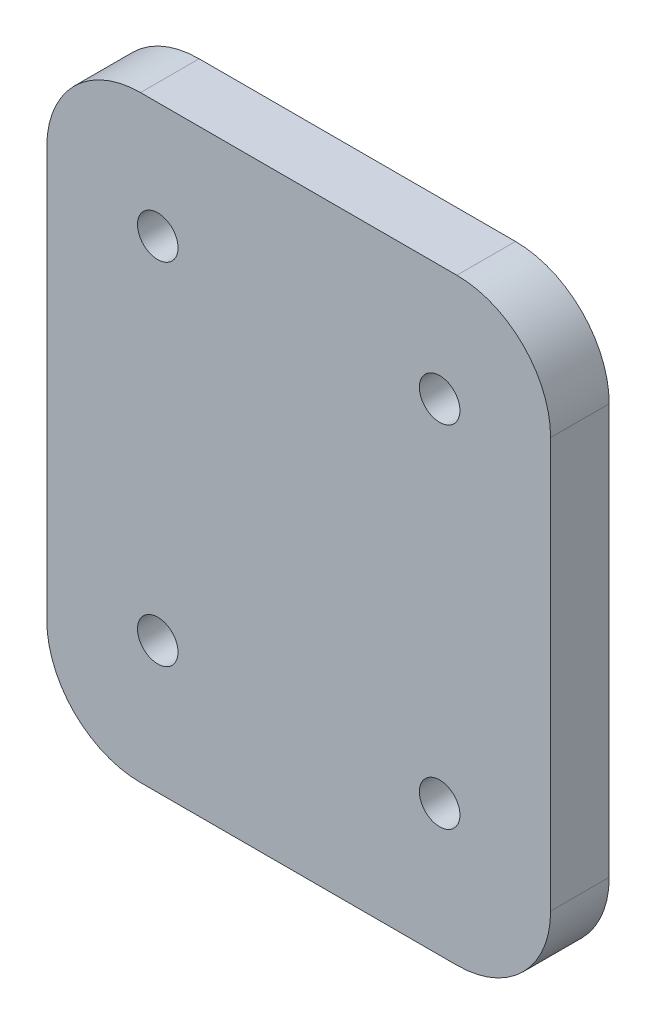
ISO-10303-21;
HEADER;
FILE_DESCRIPTION(('STEP AP214'),'2;1');
FILE_NAME('part.step','',(''),(''),'','','');
FILE_SCHEMA(('AUTOMOTIVE_DESIGN { 1 0 10303 214 1 1 1 1 }'));
ENDSEC;
DATA;
#1=APPLICATION_CONTEXT('core data for automotive mechanical design processes');
#2=APPLICATION_PROTOCOL_DEFINITION('international standard','automotive_design',2000,#1);
#3=PRODUCT_CONTEXT('',#1,'mechanical');
#4=PRODUCT('Part','Part','',(#3));
#5=PRODUCT_RELATED_PRODUCT_CATEGORY('part','',(#4));
#6=PRODUCT_DEFINITION_FORMATION('','',#4);
#7=PRODUCT_DEFINITION_CONTEXT('part definition',#1,'design');
#8=PRODUCT_DEFINITION('design','',#6,#7);
#9=PRODUCT_DEFINITION_SHAPE('','',#8);
#10=(LENGTH_UNIT() NAMED_UNIT(*) SI_UNIT(.MILLI.,.METRE.));
#11=(NAMED_UNIT(*) PLANE_ANGLE_UNIT() SI_UNIT($,.RADIAN.));
#12=(NAMED_UNIT(*) SI_UNIT($,.STERADIAN.) SOLID_ANGLE_UNIT());
#13=UNCERTAINTY_MEASURE_WITH_UNIT(LENGTH_MEASURE(1.E-05),#10,'distance_accuracy_value','');
#14=(GEOMETRIC_REPRESENTATION_CONTEXT(3) GLOBAL_UNCERTAINTY_ASSIGNED_CONTEXT((#13)) GLOBAL_UNIT_ASSIGNED_CONTEXT((#10,
#11,#12)) REPRESENTATION_CONTEXT('',''));
#15=CARTESIAN_POINT('',(0.,0.,0.));
#16=DIRECTION('',(0.,0.,1.));
#17=DIRECTION('',(1.,0.,0.));
#18=AXIS2_PLACEMENT_3D('',#15,#16,#17);
#19=CARTESIAN_POINT('',(54.2600000000001,16.7731395348769,5.));
#20=DIRECTION('',(0.,0.,1.));
#21=DIRECTION('',(1.,0.,0.));
#22=AXIS2_PLACEMENT_3D('',#19,#20,#21);
#23=PLANE('',#22);
#24=CARTESIAN_POINT('',(55.7300000000001,-14.9950000000068,5.));
#25=DIRECTION('',(0.,0.,1.));
#26=DIRECTION('',(1.,0.,0.));
#27=AXIS2_PLACEMENT_3D('',#24,#25,#26);
#28=CIRCLE('',#27,1.73);
#29=CARTESIAN_POINT('',(57.4600000000001,-14.9950000000068,5.));
#30=VERTEX_POINT('',#29);
#31=EDGE_CURVE('E224',#30,#30,#28,.T.);
#32=ORIENTED_EDGE('',*,*,#31,.F.);
#33=EDGE_LOOP('',(#32));
#34=FACE_BOUND('',#33,.T.);
#35=CARTESIAN_POINT('',(79.79,14.8949999999932,5.));
#36=DIRECTION('',(0.,0.,1.));
#37=DIRECTION('',(1.,0.,0.));
#38=AXIS2_PLACEMENT_3D('',#35,#36,#37);
#39=CIRCLE('',#38,1.72999999999999);
#40=CARTESIAN_POINT('',(81.5200000000001,14.8949999999932,5.));
#41=VERTEX_POINT('',#40);
#42=EDGE_CURVE('E149',#41,#41,#39,.T.);
#43=ORIENTED_EDGE('',*,*,#42,.F.);
#44=EDGE_LOOP('',(#43));
#45=FACE_BOUND('',#44,.T.);
#46=CARTESIAN_POINT('',(54.2600000000001,16.7731395348769,5.));
#47=DIRECTION('',(0.,0.,1.));
#48=DIRECTION('',(1.,0.,0.));
#49=AXIS2_PLACEMENT_3D('',#46,#47,#48);
#50=CIRCLE('',#49,8.);
#51=CARTESIAN_POINT('',(54.2600000000001,24.7731395348769,5.));
#52=VERTEX_POINT('',#51);
#53=CARTESIAN_POINT('',(46.2600000000001,16.7731395348769,5.));
#54=VERTEX_POINT('',#53);
#55=EDGE_CURVE('E167',#52,#54,#50,.T.);
#56=ORIENTED_EDGE('',*,*,#55,.T.);
#57=DIRECTION('',(0.,-1.,0.));
#58=VECTOR('',#57,1.);
#59=CARTESIAN_POINT('',(46.2600000000001,-18.2268604651231,5.));
#60=LINE('',#59,#58);
#61=CARTESIAN_POINT('',(46.2600000000001,-18.2268604651231,5.));
#62=VERTEX_POINT('',#61);
#63=EDGE_CURVE('E103',#54,#62,#60,.T.);
#64=ORIENTED_EDGE('',*,*,#63,.T.);
#65=CARTESIAN_POINT('',(54.2600000000001,-18.2268604651231,5.));
#66=DIRECTION('',(0.,0.,1.));
#67=DIRECTION('',(-1.,0.,0.));
#68=AXIS2_PLACEMENT_3D('',#65,#66,#67);
#69=CIRCLE('',#68,8.);
#70=CARTESIAN_POINT('',(54.2600000000001,-26.2268604651231,5.));
#71=VERTEX_POINT('',#70);
#72=EDGE_CURVE('E188',#62,#71,#69,.T.);
#73=ORIENTED_EDGE('',*,*,#72,.T.);
#74=DIRECTION('',(1.,0.,0.));
#75=VECTOR('',#74,1.);
#76=CARTESIAN_POINT('',(81.26,-26.226860465123,5.));
#77=LINE('',#76,#75);
#78=CARTESIAN_POINT('',(81.26,-26.2268604651231,5.));
#79=VERTEX_POINT('',#78);
#80=EDGE_CURVE('E202',#71,#79,#77,.T.);
#81=ORIENTED_EDGE('',*,*,#80,.T.);
#82=CARTESIAN_POINT('',(81.26,-18.226860465123,5.));
#83=DIRECTION('',(0.,0.,1.));
#84=DIRECTION('',(1.,0.,0.));
#85=AXIS2_PLACEMENT_3D('',#82,#83,#84);
#86=CIRCLE('',#85,8.00000000000001);
#87=CARTESIAN_POINT('',(89.2600000000001,-18.226860465123,5.));
#88=VERTEX_POINT('',#87);
#89=EDGE_CURVE('E122',#79,#88,#86,.T.);
#90=ORIENTED_EDGE('',*,*,#89,.T.);
#91=DIRECTION('',(0.,1.,0.));
#92=VECTOR('',#91,1.);
#93=CARTESIAN_POINT('',(89.2600000000001,-18.226860465123,5.));
#94=LINE('',#93,#92);
#95=CARTESIAN_POINT('',(89.2600000000001,16.7731395348769,5.));
#96=VERTEX_POINT('',#95);
#97=EDGE_CURVE('E116',#88,#96,#94,.T.);
#98=ORIENTED_EDGE('',*,*,#97,.T.);
#99=CARTESIAN_POINT('',(81.26,16.7731395348769,5.));
#100=DIRECTION('',(0.,0.,1.));
#101=DIRECTION('',(1.,0.,0.));
#102=AXIS2_PLACEMENT_3D('',#99,#100,#101);
#103=CIRCLE('',#102,8.);
#104=CARTESIAN_POINT('',(81.26,24.7731395348769,5.));
#105=VERTEX_POINT('',#104);
#106=EDGE_CURVE('E120',#96,#105,#103,.T.);
#107=ORIENTED_EDGE('',*,*,#106,.T.);
#108=DIRECTION('',(-1.,0.,0.));
#109=VECTOR('',#108,1.);
#110=CARTESIAN_POINT('',(81.26,24.7731395348769,5.));
#111=LINE('',#110,#109);
#112=EDGE_CURVE('E60',#105,#52,#111,.T.);
#113=ORIENTED_EDGE('',*,*,#112,.T.);
#114=EDGE_LOOP('',(#56,#64,#73,#81,#90,#98,#107,#113));
#115=FACE_BOUND('',#114,.T.);
#116=CARTESIAN_POINT('',(55.7300000000001,14.8949999999932,5.));
#117=DIRECTION('',(0.,0.,1.));
#118=DIRECTION('',(1.,0.,0.));
#119=AXIS2_PLACEMENT_3D('',#116,#117,#118);
#120=CIRCLE('',#119,1.73);
#121=CARTESIAN_POINT('',(57.4600000000001,14.8949999999932,5.));
#122=VERTEX_POINT('',#121);
#123=EDGE_CURVE('E216',#122,#122,#120,.T.);
#124=ORIENTED_EDGE('',*,*,#123,.F.);
#125=EDGE_LOOP('',(#124));
#126=FACE_BOUND('',#125,.T.);
#127=CARTESIAN_POINT('',(79.7900000000001,-14.9950000000068,5.));
#128=DIRECTION('',(0.,0.,1.));
#129=DIRECTION('',(1.,0.,0.));
#130=AXIS2_PLACEMENT_3D('',#127,#128,#129);
#131=CIRCLE('',#130,1.72999999999999);
#132=CARTESIAN_POINT('',(81.5200000000001,-14.9950000000068,5.));
#133=VERTEX_POINT('',#132);
#134=EDGE_CURVE('E232',#133,#133,#131,.T.);
#135=ORIENTED_EDGE('',*,*,#134,.F.);
#136=EDGE_LOOP('',(#135));
#137=FACE_BOUND('',#136,.T.);
#138=ADVANCED_FACE('F42',(#34,#45,#115,#126,#137),#23,.T.);
#139=CARTESIAN_POINT('',(54.2600000000001,16.7731395348769,0.));
#140=DIRECTION('',(0.,0.,1.));
#141=DIRECTION('',(1.,0.,0.));
#142=AXIS2_PLACEMENT_3D('',#139,#140,#141);
#143=PLANE('',#142);
#144=CARTESIAN_POINT('',(54.2600000000001,16.7731395348769,0.));
#145=DIRECTION('',(0.,0.,1.));
#146=DIRECTION('',(1.,0.,0.));
#147=AXIS2_PLACEMENT_3D('',#144,#145,#146);
#148=CIRCLE('',#147,8.);
#149=CARTESIAN_POINT('',(54.2600000000001,24.7731395348769,0.));
#150=VERTEX_POINT('',#149);
#151=CARTESIAN_POINT('',(46.2600000000001,16.7731395348769,0.));
#152=VERTEX_POINT('',#151);
#153=EDGE_CURVE('E144',#150,#152,#148,.T.);
#154=ORIENTED_EDGE('',*,*,#153,.F.);
#155=DIRECTION('',(-1.,0.,0.));
#156=VECTOR('',#155,1.);
#157=CARTESIAN_POINT('',(81.26,24.7731395348769,0.));
#158=LINE('',#157,#156);
#159=CARTESIAN_POINT('',(81.26,24.7731395348769,0.));
#160=VERTEX_POINT('',#159);
#161=EDGE_CURVE('E95',#160,#150,#158,.T.);
#162=ORIENTED_EDGE('',*,*,#161,.F.);
#163=CARTESIAN_POINT('',(81.26,16.7731395348769,0.));
#164=DIRECTION('',(0.,0.,1.));
#165=DIRECTION('',(1.,0.,0.));
#166=AXIS2_PLACEMENT_3D('',#163,#164,#165);
#167=CIRCLE('',#166,8.);
#168=CARTESIAN_POINT('',(89.2600000000001,16.7731395348769,0.));
#169=VERTEX_POINT('',#168);
#170=EDGE_CURVE('E89',#169,#160,#167,.T.);
#171=ORIENTED_EDGE('',*,*,#170,.F.);
#172=DIRECTION('',(0.,1.,0.));
#173=VECTOR('',#172,1.);
#174=CARTESIAN_POINT('',(89.2600000000001,-18.226860465123,0.));
#175=LINE('',#174,#173);
#176=CARTESIAN_POINT('',(89.2600000000001,-18.226860465123,0.));
#177=VERTEX_POINT('',#176);
#178=EDGE_CURVE('E131',#177,#169,#175,.T.);
#179=ORIENTED_EDGE('',*,*,#178,.F.);
#180=CARTESIAN_POINT('',(81.26,-18.226860465123,0.));
#181=DIRECTION('',(0.,0.,1.));
#182=DIRECTION('',(1.,0.,0.));
#183=AXIS2_PLACEMENT_3D('',#180,#181,#182);
#184=CIRCLE('',#183,8.00000000000001);
#185=CARTESIAN_POINT('',(81.26,-26.2268604651231,0.));
#186=VERTEX_POINT('',#185);
#187=EDGE_CURVE('E158',#186,#177,#184,.T.);
#188=ORIENTED_EDGE('',*,*,#187,.F.);
#189=DIRECTION('',(1.,0.,0.));
#190=VECTOR('',#189,1.);
#191=CARTESIAN_POINT('',(81.26,-26.226860465123,0.));
#192=LINE('',#191,#190);
#193=CARTESIAN_POINT('',(54.2600000000001,-26.2268604651231,0.));
#194=VERTEX_POINT('',#193);
#195=EDGE_CURVE('E155',#194,#186,#192,.T.);
#196=ORIENTED_EDGE('',*,*,#195,.F.);
#197=CARTESIAN_POINT('',(54.2600000000001,-18.2268604651231,0.));
#198=DIRECTION('',(0.,0.,1.));
#199=DIRECTION('',(-1.,0.,0.));
#200=AXIS2_PLACEMENT_3D('',#197,#198,#199);
#201=CIRCLE('',#200,8.);
#202=CARTESIAN_POINT('',(46.2600000000001,-18.2268604651231,0.));
#203=VERTEX_POINT('',#202);
#204=EDGE_CURVE('E152',#203,#194,#201,.T.);
#205=ORIENTED_EDGE('',*,*,#204,.F.);
#206=DIRECTION('',(0.,-1.,0.));
#207=VECTOR('',#206,1.);
#208=CARTESIAN_POINT('',(46.2600000000001,-18.2268604651231,0.));
#209=LINE('',#208,#207);
#210=EDGE_CURVE('E148',#152,#203,#209,.T.);
#211=ORIENTED_EDGE('',*,*,#210,.F.);
#212=EDGE_LOOP('',(#154,#162,#171,#179,#188,#196,#205,#211));
#213=FACE_BOUND('',#212,.T.);
#214=CARTESIAN_POINT('',(79.79,14.8949999999932,0.));
#215=DIRECTION('',(0.,0.,1.));
#216=DIRECTION('',(1.,0.,0.));
#217=AXIS2_PLACEMENT_3D('',#214,#215,#216);
#218=CIRCLE('',#217,1.72999999999999);
#219=CARTESIAN_POINT('',(81.5200000000001,14.8949999999932,0.));
#220=VERTEX_POINT('',#219);
#221=EDGE_CURVE('E212',#220,#220,#218,.T.);
#222=ORIENTED_EDGE('',*,*,#221,.T.);
#223=EDGE_LOOP('',(#222));
#224=FACE_BOUND('',#223,.T.);
#225=CARTESIAN_POINT('',(55.7300000000001,14.8949999999932,0.));
#226=DIRECTION('',(0.,0.,1.));
#227=DIRECTION('',(1.,0.,0.));
#228=AXIS2_PLACEMENT_3D('',#225,#226,#227);
#229=CIRCLE('',#228,1.73);
#230=CARTESIAN_POINT('',(57.4600000000001,14.8949999999932,0.));
#231=VERTEX_POINT('',#230);
#232=EDGE_CURVE('E220',#231,#231,#229,.T.);
#233=ORIENTED_EDGE('',*,*,#232,.T.);
#234=EDGE_LOOP('',(#233));
#235=FACE_BOUND('',#234,.T.);
#236=CARTESIAN_POINT('',(55.7300000000001,-14.9950000000068,0.));
#237=DIRECTION('',(0.,0.,1.));
#238=DIRECTION('',(1.,0.,0.));
#239=AXIS2_PLACEMENT_3D('',#236,#237,#238);
#240=CIRCLE('',#239,1.73);
#241=CARTESIAN_POINT('',(57.4600000000001,-14.9950000000068,0.));
#242=VERTEX_POINT('',#241);
#243=EDGE_CURVE('E228',#242,#242,#240,.T.);
#244=ORIENTED_EDGE('',*,*,#243,.T.);
#245=EDGE_LOOP('',(#244));
#246=FACE_BOUND('',#245,.T.);
#247=CARTESIAN_POINT('',(79.7900000000001,-14.9950000000068,0.));
#248=DIRECTION('',(0.,0.,1.));
#249=DIRECTION('',(1.,0.,0.));
#250=AXIS2_PLACEMENT_3D('',#247,#248,#249);
#251=CIRCLE('',#250,1.72999999999999);
#252=CARTESIAN_POINT('',(81.5200000000001,-14.9950000000068,0.));
#253=VERTEX_POINT('',#252);
#254=EDGE_CURVE('E236',#253,#253,#251,.T.);
#255=ORIENTED_EDGE('',*,*,#254,.T.);
#256=EDGE_LOOP('',(#255));
#257=FACE_BOUND('',#256,.T.);
#258=ADVANCED_FACE('F192',(#213,#224,#235,#246,#257),#143,.F.);
#259=CARTESIAN_POINT('',(54.2600000000001,16.7731395348769,5.));
#260=DIRECTION('',(0.,0.,-1.));
#261=DIRECTION('',(-1.,0.,0.));
#262=AXIS2_PLACEMENT_3D('',#259,#260,#261);
#263=CYLINDRICAL_SURFACE('',#262,8.);
#264=ORIENTED_EDGE('',*,*,#153,.T.);
#265=DIRECTION('',(0.,0.,-1.));
#266=VECTOR('',#265,1.);
#267=CARTESIAN_POINT('',(46.2600000000001,16.7731395348769,5.));
#268=LINE('',#267,#266);
#269=EDGE_CURVE('E11',#54,#152,#268,.T.);
#270=ORIENTED_EDGE('',*,*,#269,.F.);
#271=ORIENTED_EDGE('',*,*,#55,.F.);
#272=DIRECTION('',(0.,0.,-1.));
#273=VECTOR('',#272,1.);
#274=CARTESIAN_POINT('',(54.2600000000001,24.7731395348769,5.));
#275=LINE('',#274,#273);
#276=EDGE_CURVE('E140',#52,#150,#275,.T.);
#277=ORIENTED_EDGE('',*,*,#276,.T.);
#278=EDGE_LOOP('',(#264,#270,#271,#277));
#279=FACE_BOUND('',#278,.T.);
#280=ADVANCED_FACE('F44',(#279),#263,.T.);
#281=CARTESIAN_POINT('',(46.2600000000001,-18.2268604651231,5.));
#282=DIRECTION('',(1.,0.,0.));
#283=DIRECTION('',(0.,1.,0.));
#284=AXIS2_PLACEMENT_3D('',#281,#282,#283);
#285=PLANE('',#284);
#286=ORIENTED_EDGE('',*,*,#210,.T.);
#287=DIRECTION('',(0.,0.,-1.));
#288=VECTOR('',#287,1.);
#289=CARTESIAN_POINT('',(46.2600000000001,-18.2268604651231,5.));
#290=LINE('',#289,#288);
#291=EDGE_CURVE('E52',#62,#203,#290,.T.);
#292=ORIENTED_EDGE('',*,*,#291,.F.);
#293=ORIENTED_EDGE('',*,*,#63,.F.);
#294=ORIENTED_EDGE('',*,*,#269,.T.);
#295=EDGE_LOOP('',(#286,#292,#293,#294));
#296=FACE_BOUND('',#295,.T.);
#297=ADVANCED_FACE('F272',(#296),#285,.F.);
#298=CARTESIAN_POINT('',(54.2600000000001,-18.2268604651231,5.));
#299=DIRECTION('',(0.,0.,-1.));
#300=DIRECTION('',(-1.,0.,0.));
#301=AXIS2_PLACEMENT_3D('',#298,#299,#300);
#302=CYLINDRICAL_SURFACE('',#301,8.);
#303=ORIENTED_EDGE('',*,*,#204,.T.);
#304=DIRECTION('',(0.,0.,-1.));
#305=VECTOR('',#304,1.);
#306=CARTESIAN_POINT('',(54.2600000000001,-26.2268604651231,5.));
#307=LINE('',#306,#305);
#308=EDGE_CURVE('E178',#71,#194,#307,.T.);
#309=ORIENTED_EDGE('',*,*,#308,.F.);
#310=ORIENTED_EDGE('',*,*,#72,.F.);
#311=ORIENTED_EDGE('',*,*,#291,.T.);
#312=EDGE_LOOP('',(#303,#309,#310,#311));
#313=FACE_BOUND('',#312,.T.);
#314=ADVANCED_FACE('F186',(#313),#302,.T.);
#315=CARTESIAN_POINT('',(81.26,-26.226860465123,5.));
#316=DIRECTION('',(0.,1.,0.));
#317=DIRECTION('',(-1.,0.,0.));
#318=AXIS2_PLACEMENT_3D('',#315,#316,#317);
#319=PLANE('',#318);
#320=ORIENTED_EDGE('',*,*,#195,.T.);
#321=DIRECTION('',(0.,0.,-1.));
#322=VECTOR('',#321,1.);
#323=CARTESIAN_POINT('',(81.26,-26.2268604651231,5.));
#324=LINE('',#323,#322);
#325=EDGE_CURVE('E174',#79,#186,#324,.T.);
#326=ORIENTED_EDGE('',*,*,#325,.F.);
#327=ORIENTED_EDGE('',*,*,#80,.F.);
#328=ORIENTED_EDGE('',*,*,#308,.T.);
#329=EDGE_LOOP('',(#320,#326,#327,#328));
#330=FACE_BOUND('',#329,.T.);
#331=ADVANCED_FACE('F197',(#330),#319,.F.);
#332=CARTESIAN_POINT('',(81.26,-18.226860465123,5.));
#333=DIRECTION('',(0.,0.,-1.));
#334=DIRECTION('',(-1.,0.,0.));
#335=AXIS2_PLACEMENT_3D('',#332,#333,#334);
#336=CYLINDRICAL_SURFACE('',#335,8.00000000000001);
#337=ORIENTED_EDGE('',*,*,#187,.T.);
#338=DIRECTION('',(0.,0.,-1.));
#339=VECTOR('',#338,1.);
#340=CARTESIAN_POINT('',(89.2600000000001,-18.226860465123,5.));
#341=LINE('',#340,#339);
#342=EDGE_CURVE('E133',#88,#177,#341,.T.);
#343=ORIENTED_EDGE('',*,*,#342,.F.);
#344=ORIENTED_EDGE('',*,*,#89,.F.);
#345=ORIENTED_EDGE('',*,*,#325,.T.);
#346=EDGE_LOOP('',(#337,#343,#344,#345));
#347=FACE_BOUND('',#346,.T.);
#348=ADVANCED_FACE('F200',(#347),#336,.T.);
#349=CARTESIAN_POINT('',(89.2600000000001,-18.226860465123,5.));
#350=DIRECTION('',(-1.,0.,0.));
#351=DIRECTION('',(0.,-1.,0.));
#352=AXIS2_PLACEMENT_3D('',#349,#350,#351);
#353=PLANE('',#352);
#354=ORIENTED_EDGE('',*,*,#178,.T.);
#355=DIRECTION('',(0.,0.,-1.));
#356=VECTOR('',#355,1.);
#357=CARTESIAN_POINT('',(89.2600000000001,16.7731395348769,5.));
#358=LINE('',#357,#356);
#359=EDGE_CURVE('E128',#96,#169,#358,.T.);
#360=ORIENTED_EDGE('',*,*,#359,.F.);
#361=ORIENTED_EDGE('',*,*,#97,.F.);
#362=ORIENTED_EDGE('',*,*,#342,.T.);
#363=EDGE_LOOP('',(#354,#360,#361,#362));
#364=FACE_BOUND('',#363,.T.);
#365=ADVANCED_FACE('F129',(#364),#353,.F.);
#366=CARTESIAN_POINT('',(81.26,16.7731395348769,5.));
#367=DIRECTION('',(0.,0.,-1.));
#368=DIRECTION('',(-1.,0.,0.));
#369=AXIS2_PLACEMENT_3D('',#366,#367,#368);
#370=CYLINDRICAL_SURFACE('',#369,8.);
#371=ORIENTED_EDGE('',*,*,#170,.T.);
#372=DIRECTION('',(0.,0.,-1.));
#373=VECTOR('',#372,1.);
#374=CARTESIAN_POINT('',(81.26,24.7731395348769,5.));
#375=LINE('',#374,#373);
#376=EDGE_CURVE('E134',#105,#160,#375,.T.);
#377=ORIENTED_EDGE('',*,*,#376,.F.);
#378=ORIENTED_EDGE('',*,*,#106,.F.);
#379=ORIENTED_EDGE('',*,*,#359,.T.);
#380=EDGE_LOOP('',(#371,#377,#378,#379));
#381=FACE_BOUND('',#380,.T.);
#382=ADVANCED_FACE('F136',(#381),#370,.T.);
#383=CARTESIAN_POINT('',(81.26,24.7731395348769,5.));
#384=DIRECTION('',(0.,-1.,0.));
#385=DIRECTION('',(1.,0.,0.));
#386=AXIS2_PLACEMENT_3D('',#383,#384,#385);
#387=PLANE('',#386);
#388=ORIENTED_EDGE('',*,*,#161,.T.);
#389=ORIENTED_EDGE('',*,*,#276,.F.);
#390=ORIENTED_EDGE('',*,*,#112,.F.);
#391=ORIENTED_EDGE('',*,*,#376,.T.);
#392=EDGE_LOOP('',(#388,#389,#390,#391));
#393=FACE_BOUND('',#392,.T.);
#394=ADVANCED_FACE('F260',(#393),#387,.F.);
#395=CARTESIAN_POINT('',(79.79,14.8949999999932,5.));
#396=DIRECTION('',(0.,0.,-1.));
#397=DIRECTION('',(-1.,0.,0.));
#398=AXIS2_PLACEMENT_3D('',#395,#396,#397);
#399=CYLINDRICAL_SURFACE('',#398,1.72999999999999);
#400=ORIENTED_EDGE('',*,*,#42,.T.);
#401=EDGE_LOOP('',(#400));
#402=FACE_BOUND('',#401,.T.);
#403=ORIENTED_EDGE('',*,*,#221,.F.);
#404=EDGE_LOOP('',(#403));
#405=FACE_BOUND('',#404,.T.);
#406=ADVANCED_FACE('F257',(#402,#405),#399,.F.);
#407=CARTESIAN_POINT('',(55.7300000000001,14.8949999999932,5.));
#408=DIRECTION('',(0.,0.,-1.));
#409=DIRECTION('',(-1.,0.,0.));
#410=AXIS2_PLACEMENT_3D('',#407,#408,#409);
#411=CYLINDRICAL_SURFACE('',#410,1.73);
#412=ORIENTED_EDGE('',*,*,#123,.T.);
#413=EDGE_LOOP('',(#412));
#414=FACE_BOUND('',#413,.T.);
#415=ORIENTED_EDGE('',*,*,#232,.F.);
#416=EDGE_LOOP('',(#415));
#417=FACE_BOUND('',#416,.T.);
#418=ADVANCED_FACE('F348',(#414,#417),#411,.F.);
#419=CARTESIAN_POINT('',(55.7300000000001,-14.9950000000068,5.));
#420=DIRECTION('',(0.,0.,-1.));
#421=DIRECTION('',(-1.,0.,0.));
#422=AXIS2_PLACEMENT_3D('',#419,#420,#421);
#423=CYLINDRICAL_SURFACE('',#422,1.73);
#424=ORIENTED_EDGE('',*,*,#31,.T.);
#425=EDGE_LOOP('',(#424));
#426=FACE_BOUND('',#425,.T.);
#427=ORIENTED_EDGE('',*,*,#243,.F.);
#428=EDGE_LOOP('',(#427));
#429=FACE_BOUND('',#428,.T.);
#430=ADVANCED_FACE('F357',(#426,#429),#423,.F.);
#431=CARTESIAN_POINT('',(79.7900000000001,-14.9950000000068,5.));
#432=DIRECTION('',(0.,0.,-1.));
#433=DIRECTION('',(-1.,0.,0.));
#434=AXIS2_PLACEMENT_3D('',#431,#432,#433);
#435=CYLINDRICAL_SURFACE('',#434,1.72999999999999);
#436=ORIENTED_EDGE('',*,*,#134,.T.);
#437=EDGE_LOOP('',(#436));
#438=FACE_BOUND('',#437,.T.);
#439=ORIENTED_EDGE('',*,*,#254,.F.);
#440=EDGE_LOOP('',(#439));
#441=FACE_BOUND('',#440,.T.);
#442=ADVANCED_FACE('F244',(#438,#441),#435,.F.);
#443=CLOSED_SHELL('',(#138,#258,#280,#297,#314,#331,#348,#365,#382,#394,#406,#418,#430,#442));
#444=MANIFOLD_SOLID_BREP('B2',#443);
#445=ADVANCED_BREP_SHAPE_REPRESENTATION('',(#18,#444),#14);
#446=SHAPE_DEFINITION_REPRESENTATION(#9,#445);
ENDSEC;
END-ISO-10303-21;
